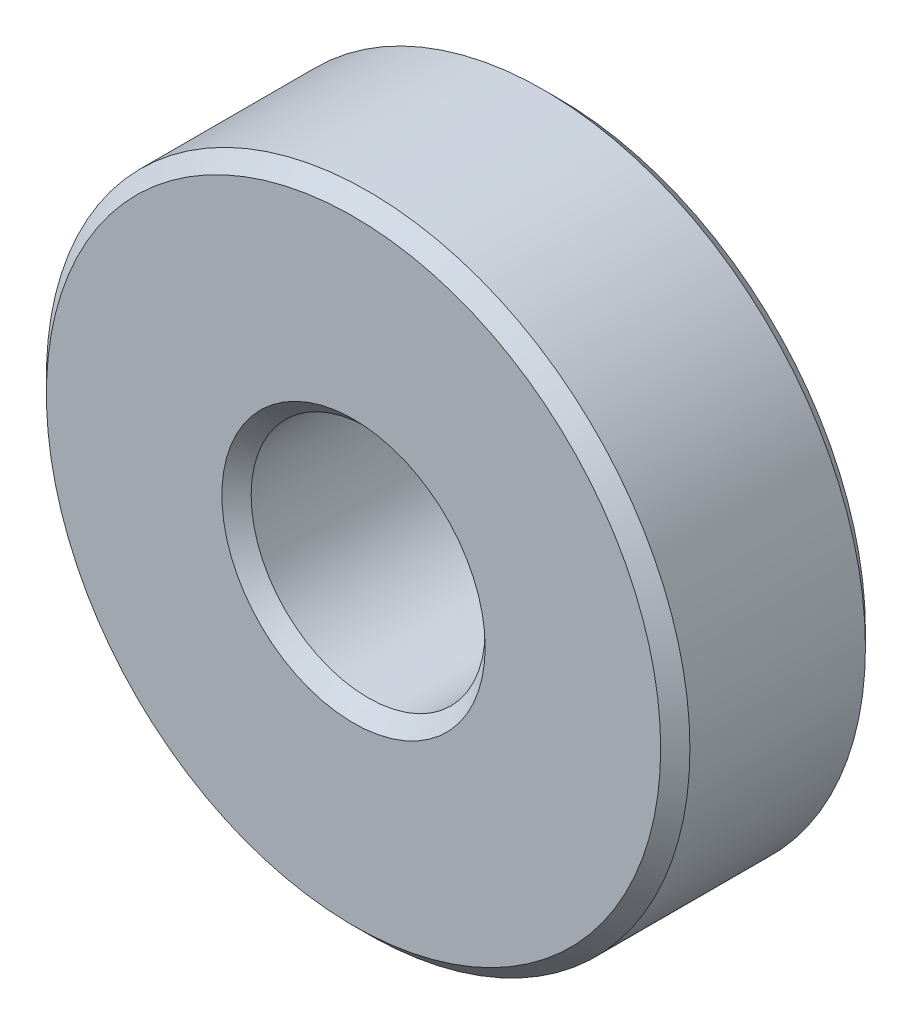
ISO-10303-21;
HEADER;
FILE_DESCRIPTION(('STEP AP214'),'2;1');
FILE_NAME('part.step','',(''),(''),'','','');
FILE_SCHEMA(('AUTOMOTIVE_DESIGN { 1 0 10303 214 1 1 1 1 }'));
ENDSEC;
DATA;
#1=APPLICATION_CONTEXT('core data for automotive mechanical design processes');
#2=APPLICATION_PROTOCOL_DEFINITION('international standard','automotive_design',2000,#1);
#3=PRODUCT_CONTEXT('',#1,'mechanical');
#4=PRODUCT('Part','Part','',(#3));
#5=PRODUCT_RELATED_PRODUCT_CATEGORY('part','',(#4));
#6=PRODUCT_DEFINITION_FORMATION('','',#4);
#7=PRODUCT_DEFINITION_CONTEXT('part definition',#1,'design');
#8=PRODUCT_DEFINITION('design','',#6,#7);
#9=PRODUCT_DEFINITION_SHAPE('','',#8);
#10=(LENGTH_UNIT() NAMED_UNIT(*) SI_UNIT(.MILLI.,.METRE.));
#11=(NAMED_UNIT(*) PLANE_ANGLE_UNIT() SI_UNIT($,.RADIAN.));
#12=(NAMED_UNIT(*) SI_UNIT($,.STERADIAN.) SOLID_ANGLE_UNIT());
#13=UNCERTAINTY_MEASURE_WITH_UNIT(LENGTH_MEASURE(1.E-05),#10,'distance_accuracy_value','');
#14=(GEOMETRIC_REPRESENTATION_CONTEXT(3) GLOBAL_UNCERTAINTY_ASSIGNED_CONTEXT((#13)) GLOBAL_UNIT_ASSIGNED_CONTEXT((#10,
#11,#12)) REPRESENTATION_CONTEXT('',''));
#15=CARTESIAN_POINT('',(0.,0.,0.));
#16=DIRECTION('',(0.,0.,1.));
#17=DIRECTION('',(1.,0.,0.));
#18=AXIS2_PLACEMENT_3D('',#15,#16,#17);
#19=CARTESIAN_POINT('',(0.,0.,7.));
#20=DIRECTION('',(0.,0.,1.));
#21=DIRECTION('',(1.,0.,0.));
#22=AXIS2_PLACEMENT_3D('',#19,#20,#21);
#23=PLANE('',#22);
#24=CARTESIAN_POINT('',(0.,0.,7.));
#25=DIRECTION('',(0.,0.,1.));
#26=DIRECTION('',(1.,0.,0.));
#27=AXIS2_PLACEMENT_3D('',#24,#25,#26);
#28=CIRCLE('',#27,4.5);
#29=CARTESIAN_POINT('',(4.5,0.,7.));
#30=VERTEX_POINT('',#29);
#31=EDGE_CURVE('E10',#30,#30,#28,.F.);
#32=ORIENTED_EDGE('',*,*,#31,.T.);
#33=EDGE_LOOP('',(#32));
#34=FACE_BOUND('',#33,.T.);
#35=CARTESIAN_POINT('',(0.,0.,7.));
#36=DIRECTION('',(0.,0.,1.));
#37=DIRECTION('',(1.,0.,0.));
#38=AXIS2_PLACEMENT_3D('',#35,#36,#37);
#39=CIRCLE('',#38,10.5);
#40=CARTESIAN_POINT('',(10.5,0.,7.));
#41=VERTEX_POINT('',#40);
#42=EDGE_CURVE('E47',#41,#41,#39,.T.);
#43=ORIENTED_EDGE('',*,*,#42,.T.);
#44=EDGE_LOOP('',(#43));
#45=FACE_BOUND('',#44,.T.);
#46=ADVANCED_FACE('F39',(#34,#45),#23,.T.);
#47=CARTESIAN_POINT('',(0.,0.,0.));
#48=DIRECTION('',(0.,0.,1.));
#49=DIRECTION('',(1.,0.,0.));
#50=AXIS2_PLACEMENT_3D('',#47,#48,#49);
#51=PLANE('',#50);
#52=CARTESIAN_POINT('',(0.,0.,0.));
#53=DIRECTION('',(0.,0.,1.));
#54=DIRECTION('',(1.,0.,0.));
#55=AXIS2_PLACEMENT_3D('',#52,#53,#54);
#56=CIRCLE('',#55,10.5);
#57=CARTESIAN_POINT('',(10.5,0.,0.));
#58=VERTEX_POINT('',#57);
#59=EDGE_CURVE('E60',#58,#58,#56,.F.);
#60=ORIENTED_EDGE('',*,*,#59,.T.);
#61=EDGE_LOOP('',(#60));
#62=FACE_BOUND('',#61,.T.);
#63=CARTESIAN_POINT('',(0.,0.,0.));
#64=DIRECTION('',(0.,0.,1.));
#65=DIRECTION('',(1.,0.,0.));
#66=AXIS2_PLACEMENT_3D('',#63,#64,#65);
#67=CIRCLE('',#66,4.5);
#68=CARTESIAN_POINT('',(4.5,0.,0.));
#69=VERTEX_POINT('',#68);
#70=EDGE_CURVE('E63',#69,#69,#67,.T.);
#71=ORIENTED_EDGE('',*,*,#70,.T.);
#72=EDGE_LOOP('',(#71));
#73=FACE_BOUND('',#72,.T.);
#74=ADVANCED_FACE('F84',(#62,#73),#51,.F.);
#75=CARTESIAN_POINT('',(0.,0.,7.));
#76=DIRECTION('',(0.,0.,-1.));
#77=DIRECTION('',(-1.,0.,0.));
#78=AXIS2_PLACEMENT_3D('',#75,#76,#77);
#79=CYLINDRICAL_SURFACE('',#78,11.);
#80=CARTESIAN_POINT('',(0.,0.,0.499999999999997));
#81=DIRECTION('',(0.,0.,1.));
#82=DIRECTION('',(1.,0.,0.));
#83=AXIS2_PLACEMENT_3D('',#80,#81,#82);
#84=CIRCLE('',#83,11.);
#85=CARTESIAN_POINT('',(11.,0.,0.499999999999997));
#86=VERTEX_POINT('',#85);
#87=EDGE_CURVE('E66',#86,#86,#84,.T.);
#88=ORIENTED_EDGE('',*,*,#87,.T.);
#89=EDGE_LOOP('',(#88));
#90=FACE_BOUND('',#89,.T.);
#91=CARTESIAN_POINT('',(0.,0.,6.50000000000001));
#92=DIRECTION('',(0.,0.,1.));
#93=DIRECTION('',(1.,0.,0.));
#94=AXIS2_PLACEMENT_3D('',#91,#92,#93);
#95=CIRCLE('',#94,11.);
#96=CARTESIAN_POINT('',(11.,0.,6.50000000000001));
#97=VERTEX_POINT('',#96);
#98=EDGE_CURVE('E69',#97,#97,#95,.F.);
#99=ORIENTED_EDGE('',*,*,#98,.T.);
#100=EDGE_LOOP('',(#99));
#101=FACE_BOUND('',#100,.T.);
#102=ADVANCED_FACE('F73',(#90,#101),#79,.T.);
#103=CARTESIAN_POINT('',(0.,0.,7.));
#104=DIRECTION('',(0.,0.,-1.));
#105=DIRECTION('',(-1.,0.,0.));
#106=AXIS2_PLACEMENT_3D('',#103,#104,#105);
#107=CYLINDRICAL_SURFACE('',#106,4.);
#108=CARTESIAN_POINT('',(0.,0.,0.5));
#109=DIRECTION('',(0.,0.,1.));
#110=DIRECTION('',(1.,0.,0.));
#111=AXIS2_PLACEMENT_3D('',#108,#109,#110);
#112=CIRCLE('',#111,4.);
#113=CARTESIAN_POINT('',(4.,0.,0.5));
#114=VERTEX_POINT('',#113);
#115=EDGE_CURVE('E51',#114,#114,#112,.F.);
#116=ORIENTED_EDGE('',*,*,#115,.T.);
#117=EDGE_LOOP('',(#116));
#118=FACE_BOUND('',#117,.T.);
#119=CARTESIAN_POINT('',(0.,0.,6.50000000000001));
#120=DIRECTION('',(0.,0.,1.));
#121=DIRECTION('',(1.,0.,0.));
#122=AXIS2_PLACEMENT_3D('',#119,#120,#121);
#123=CIRCLE('',#122,4.);
#124=CARTESIAN_POINT('',(4.,0.,6.50000000000001));
#125=VERTEX_POINT('',#124);
#126=EDGE_CURVE('E55',#125,#125,#123,.T.);
#127=ORIENTED_EDGE('',*,*,#126,.T.);
#128=EDGE_LOOP('',(#127));
#129=FACE_BOUND('',#128,.T.);
#130=ADVANCED_FACE('F92',(#118,#129),#107,.F.);
#131=CARTESIAN_POINT('',(0.,0.,0.499999999999997));
#132=DIRECTION('',(0.,0.,1.));
#133=DIRECTION('',(1.,0.,0.));
#134=AXIS2_PLACEMENT_3D('',#131,#132,#133);
#135=CONICAL_SURFACE('',#134,11.,0.785398163397452);
#136=ORIENTED_EDGE('',*,*,#59,.F.);
#137=EDGE_LOOP('',(#136));
#138=FACE_BOUND('',#137,.T.);
#139=ORIENTED_EDGE('',*,*,#87,.F.);
#140=EDGE_LOOP('',(#139));
#141=FACE_BOUND('',#140,.T.);
#142=ADVANCED_FACE('F98',(#138,#141),#135,.T.);
#143=CARTESIAN_POINT('',(0.,0.,0.));
#144=DIRECTION('',(0.,0.,-1.));
#145=DIRECTION('',(-1.,0.,0.));
#146=AXIS2_PLACEMENT_3D('',#143,#144,#145);
#147=CONICAL_SURFACE('',#146,4.5,0.785398163397445);
#148=ORIENTED_EDGE('',*,*,#115,.F.);
#149=EDGE_LOOP('',(#148));
#150=FACE_BOUND('',#149,.T.);
#151=ORIENTED_EDGE('',*,*,#70,.F.);
#152=EDGE_LOOP('',(#151));
#153=FACE_BOUND('',#152,.T.);
#154=ADVANCED_FACE('F81',(#150,#153),#147,.F.);
#155=CARTESIAN_POINT('',(0.,0.,6.50000000000001));
#156=DIRECTION('',(0.,0.,1.));
#157=DIRECTION('',(1.,0.,0.));
#158=AXIS2_PLACEMENT_3D('',#155,#156,#157);
#159=CONICAL_SURFACE('',#158,4.,0.785398163397452);
#160=ORIENTED_EDGE('',*,*,#31,.F.);
#161=EDGE_LOOP('',(#160));
#162=FACE_BOUND('',#161,.T.);
#163=ORIENTED_EDGE('',*,*,#126,.F.);
#164=EDGE_LOOP('',(#163));
#165=FACE_BOUND('',#164,.T.);
#166=ADVANCED_FACE('F77',(#162,#165),#159,.F.);
#167=CARTESIAN_POINT('',(0.,0.,7.));
#168=DIRECTION('',(0.,0.,-1.));
#169=DIRECTION('',(-1.,0.,0.));
#170=AXIS2_PLACEMENT_3D('',#167,#168,#169);
#171=CONICAL_SURFACE('',#170,10.5,0.785398163397448);
#172=ORIENTED_EDGE('',*,*,#98,.F.);
#173=EDGE_LOOP('',(#172));
#174=FACE_BOUND('',#173,.T.);
#175=ORIENTED_EDGE('',*,*,#42,.F.);
#176=EDGE_LOOP('',(#175));
#177=FACE_BOUND('',#176,.T.);
#178=ADVANCED_FACE('F42',(#174,#177),#171,.T.);
#179=CLOSED_SHELL('',(#46,#74,#102,#130,#142,#154,#166,#178));
#180=MANIFOLD_SOLID_BREP('B2',#179);
#181=ADVANCED_BREP_SHAPE_REPRESENTATION('',(#18,#180),#14);
#182=SHAPE_DEFINITION_REPRESENTATION(#9,#181);
ENDSEC;
END-ISO-10303-21;
